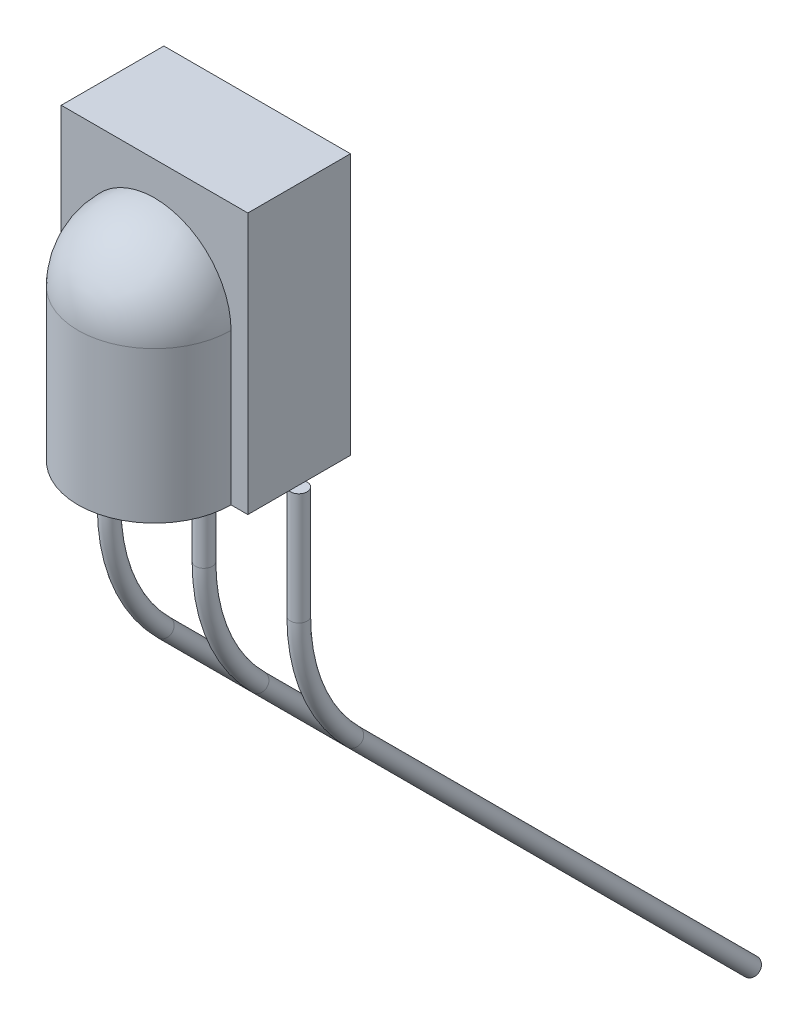
ISO-10303-21;
HEADER;
FILE_DESCRIPTION(('STEP AP214'),'2;1');
FILE_NAME('part.step','',(''),(''),'','','');
FILE_SCHEMA(('AUTOMOTIVE_DESIGN { 1 0 10303 214 1 1 1 1 }'));
ENDSEC;
DATA;
#1=APPLICATION_CONTEXT('core data for automotive mechanical design processes');
#2=APPLICATION_PROTOCOL_DEFINITION('international standard','automotive_design',2000,#1);
#3=PRODUCT_CONTEXT('',#1,'mechanical');
#4=PRODUCT('Part','Part','',(#3));
#5=PRODUCT_RELATED_PRODUCT_CATEGORY('part','',(#4));
#6=PRODUCT_DEFINITION_FORMATION('','',#4);
#7=PRODUCT_DEFINITION_CONTEXT('part definition',#1,'design');
#8=PRODUCT_DEFINITION('design','',#6,#7);
#9=PRODUCT_DEFINITION_SHAPE('','',#8);
#10=(LENGTH_UNIT() NAMED_UNIT(*) SI_UNIT(.MILLI.,.METRE.));
#11=(NAMED_UNIT(*) PLANE_ANGLE_UNIT() SI_UNIT($,.RADIAN.));
#12=(NAMED_UNIT(*) SI_UNIT($,.STERADIAN.) SOLID_ANGLE_UNIT());
#13=UNCERTAINTY_MEASURE_WITH_UNIT(LENGTH_MEASURE(1.E-05),#10,'distance_accuracy_value','');
#14=(GEOMETRIC_REPRESENTATION_CONTEXT(3) GLOBAL_UNCERTAINTY_ASSIGNED_CONTEXT((#13)) GLOBAL_UNIT_ASSIGNED_CONTEXT((#10,
#11,#12)) REPRESENTATION_CONTEXT('',''));
#15=CARTESIAN_POINT('',(0.,0.,0.));
#16=DIRECTION('',(0.,0.,1.));
#17=DIRECTION('',(1.,0.,0.));
#18=AXIS2_PLACEMENT_3D('',#15,#16,#17);
#19=CARTESIAN_POINT('',(0.,7.,-2.05));
#20=DIRECTION('',(0.,-1.,0.));
#21=DIRECTION('',(0.,0.,-1.));
#22=AXIS2_PLACEMENT_3D('',#19,#20,#21);
#23=CYLINDRICAL_SURFACE('',#22,2.05);
#24=CARTESIAN_POINT('',(0.,4.05,-2.05));
#25=DIRECTION('',(0.,1.,0.));
#26=DIRECTION('',(0.,0.,1.));
#27=AXIS2_PLACEMENT_3D('',#24,#25,#26);
#28=CIRCLE('',#27,2.05);
#29=CARTESIAN_POINT('',(-2.05,4.04999999999999,-2.05));
#30=VERTEX_POINT('',#29);
#31=CARTESIAN_POINT('',(2.05,4.04999999999999,-2.05));
#32=VERTEX_POINT('',#31);
#33=EDGE_CURVE('E150',#30,#32,#28,.T.);
#34=ORIENTED_EDGE('',*,*,#33,.F.);
#35=DIRECTION('',(0.,-1.,0.));
#36=VECTOR('',#35,1.);
#37=CARTESIAN_POINT('',(-2.05,7.,-2.05));
#38=LINE('',#37,#36);
#39=CARTESIAN_POINT('',(-2.05,0.,-2.05));
#40=VERTEX_POINT('',#39);
#41=EDGE_CURVE('E192',#30,#40,#38,.T.);
#42=ORIENTED_EDGE('',*,*,#41,.T.);
#43=CARTESIAN_POINT('',(0.,0.,-2.05));
#44=DIRECTION('',(0.,1.,0.));
#45=DIRECTION('',(0.,0.,1.));
#46=AXIS2_PLACEMENT_3D('',#43,#44,#45);
#47=CIRCLE('',#46,2.05);
#48=CARTESIAN_POINT('',(2.05,0.,-2.05));
#49=VERTEX_POINT('',#48);
#50=EDGE_CURVE('E173',#40,#49,#47,.T.);
#51=ORIENTED_EDGE('',*,*,#50,.T.);
#52=DIRECTION('',(0.,-1.,0.));
#53=VECTOR('',#52,1.);
#54=CARTESIAN_POINT('',(2.05,7.,-2.05));
#55=LINE('',#54,#53);
#56=EDGE_CURVE('E190',#32,#49,#55,.T.);
#57=ORIENTED_EDGE('',*,*,#56,.F.);
#58=EDGE_LOOP('',(#34,#42,#51,#57));
#59=FACE_BOUND('',#58,.T.);
#60=ADVANCED_FACE('F33',(#59),#23,.T.);
#61=CARTESIAN_POINT('',(0.,7.,-2.05));
#62=DIRECTION('',(0.,1.,0.));
#63=DIRECTION('',(0.,0.,1.));
#64=AXIS2_PLACEMENT_3D('',#61,#62,#63);
#65=PLANE('',#64);
#66=DIRECTION('',(1.,0.,0.));
#67=VECTOR('',#66,1.);
#68=CARTESIAN_POINT('',(-2.5,7.,-2.05));
#69=LINE('',#68,#67);
#70=CARTESIAN_POINT('',(-2.5,7.,-2.05));
#71=VERTEX_POINT('',#70);
#72=CARTESIAN_POINT('',(2.5,7.,-2.05));
#73=VERTEX_POINT('',#72);
#74=EDGE_CURVE('E159',#71,#73,#69,.T.);
#75=ORIENTED_EDGE('',*,*,#74,.T.);
#76=DIRECTION('',(0.,0.,-1.));
#77=VECTOR('',#76,1.);
#78=CARTESIAN_POINT('',(2.5,7.,-2.05));
#79=LINE('',#78,#77);
#80=CARTESIAN_POINT('',(2.5,7.,-4.8));
#81=VERTEX_POINT('',#80);
#82=EDGE_CURVE('E162',#73,#81,#79,.T.);
#83=ORIENTED_EDGE('',*,*,#82,.T.);
#84=DIRECTION('',(-1.,0.,0.));
#85=VECTOR('',#84,1.);
#86=CARTESIAN_POINT('',(-2.5,7.,-4.8));
#87=LINE('',#86,#85);
#88=CARTESIAN_POINT('',(-2.5,7.,-4.8));
#89=VERTEX_POINT('',#88);
#90=EDGE_CURVE('E164',#81,#89,#87,.T.);
#91=ORIENTED_EDGE('',*,*,#90,.T.);
#92=DIRECTION('',(0.,0.,1.));
#93=VECTOR('',#92,1.);
#94=CARTESIAN_POINT('',(-2.5,7.,-2.05));
#95=LINE('',#94,#93);
#96=EDGE_CURVE('E156',#89,#71,#95,.T.);
#97=ORIENTED_EDGE('',*,*,#96,.T.);
#98=EDGE_LOOP('',(#75,#83,#91,#97));
#99=FACE_BOUND('',#98,.T.);
#100=ADVANCED_FACE('F242',(#99),#65,.T.);
#101=CARTESIAN_POINT('',(-2.5,7.,-2.05));
#102=DIRECTION('',(1.,0.,0.));
#103=DIRECTION('',(0.,0.,-1.));
#104=AXIS2_PLACEMENT_3D('',#101,#102,#103);
#105=PLANE('',#104);
#106=DIRECTION('',(0.,0.,1.));
#107=VECTOR('',#106,1.);
#108=CARTESIAN_POINT('',(-2.5,0.,-2.05));
#109=LINE('',#108,#107);
#110=CARTESIAN_POINT('',(-2.5,0.,-4.8));
#111=VERTEX_POINT('',#110);
#112=CARTESIAN_POINT('',(-2.5,0.,-3.59641589825484));
#113=VERTEX_POINT('',#112);
#114=EDGE_CURVE('E167',#111,#113,#109,.T.);
#115=ORIENTED_EDGE('',*,*,#114,.T.);
#116=CARTESIAN_POINT('',(-2.5,0.,-3.15358410174515));
#117=VERTEX_POINT('',#116);
#118=EDGE_CURVE('E170',#113,#117,#109,.T.);
#119=ORIENTED_EDGE('',*,*,#118,.T.);
#120=CARTESIAN_POINT('',(-2.5,0.,-2.05));
#121=VERTEX_POINT('',#120);
#122=EDGE_CURVE('E155',#117,#121,#109,.T.);
#123=ORIENTED_EDGE('',*,*,#122,.T.);
#124=DIRECTION('',(0.,-1.,0.));
#125=VECTOR('',#124,1.);
#126=CARTESIAN_POINT('',(-2.5,7.,-2.05));
#127=LINE('',#126,#125);
#128=EDGE_CURVE('E194',#71,#121,#127,.T.);
#129=ORIENTED_EDGE('',*,*,#128,.F.);
#130=ORIENTED_EDGE('',*,*,#96,.F.);
#131=DIRECTION('',(0.,-1.,0.));
#132=VECTOR('',#131,1.);
#133=CARTESIAN_POINT('',(-2.5,7.,-4.8));
#134=LINE('',#133,#132);
#135=EDGE_CURVE('E166',#89,#111,#134,.T.);
#136=ORIENTED_EDGE('',*,*,#135,.T.);
#137=EDGE_LOOP('',(#115,#119,#123,#129,#130,#136));
#138=FACE_BOUND('',#137,.T.);
#139=ADVANCED_FACE('F35',(#138),#105,.F.);
#140=CARTESIAN_POINT('',(2.05,7.,-2.05));
#141=DIRECTION('',(0.,0.,-1.));
#142=DIRECTION('',(-1.,0.,0.));
#143=AXIS2_PLACEMENT_3D('',#140,#141,#142);
#144=PLANE('',#143);
#145=DIRECTION('',(0.,-1.,0.));
#146=VECTOR('',#145,1.);
#147=CARTESIAN_POINT('',(2.5,7.,-2.05));
#148=LINE('',#147,#146);
#149=CARTESIAN_POINT('',(2.5,0.,-2.05));
#150=VERTEX_POINT('',#149);
#151=EDGE_CURVE('E188',#73,#150,#148,.T.);
#152=ORIENTED_EDGE('',*,*,#151,.F.);
#153=ORIENTED_EDGE('',*,*,#74,.F.);
#154=ORIENTED_EDGE('',*,*,#128,.T.);
#155=DIRECTION('',(1.,0.,0.));
#156=VECTOR('',#155,1.);
#157=CARTESIAN_POINT('',(-2.5,0.,-2.05));
#158=LINE('',#157,#156);
#159=EDGE_CURVE('E169',#121,#40,#158,.T.);
#160=ORIENTED_EDGE('',*,*,#159,.T.);
#161=ORIENTED_EDGE('',*,*,#41,.F.);
#162=CARTESIAN_POINT('',(0.,4.05,-2.05));
#163=DIRECTION('',(0.,0.,1.));
#164=DIRECTION('',(1.,0.,0.));
#165=AXIS2_PLACEMENT_3D('',#162,#163,#164);
#166=CIRCLE('',#165,2.05);
#167=EDGE_CURVE('E153',#32,#30,#166,.T.);
#168=ORIENTED_EDGE('',*,*,#167,.F.);
#169=ORIENTED_EDGE('',*,*,#56,.T.);
#170=DIRECTION('',(1.,0.,0.));
#171=VECTOR('',#170,1.);
#172=CARTESIAN_POINT('',(2.05,0.,-2.05));
#173=LINE('',#172,#171);
#174=EDGE_CURVE('E176',#49,#150,#173,.T.);
#175=ORIENTED_EDGE('',*,*,#174,.T.);
#176=EDGE_LOOP('',(#152,#153,#154,#160,#161,#168,#169,#175));
#177=FACE_BOUND('',#176,.T.);
#178=ADVANCED_FACE('F213',(#177),#144,.F.);
#179=CARTESIAN_POINT('',(2.5,7.,-2.05));
#180=DIRECTION('',(-1.,0.,0.));
#181=DIRECTION('',(0.,0.,1.));
#182=AXIS2_PLACEMENT_3D('',#179,#180,#181);
#183=PLANE('',#182);
#184=DIRECTION('',(0.,0.,-1.));
#185=VECTOR('',#184,1.);
#186=CARTESIAN_POINT('',(2.5,0.,-2.05));
#187=LINE('',#186,#185);
#188=CARTESIAN_POINT('',(2.5,0.,-3.15358410174515));
#189=VERTEX_POINT('',#188);
#190=EDGE_CURVE('E180',#150,#189,#187,.T.);
#191=ORIENTED_EDGE('',*,*,#190,.T.);
#192=CARTESIAN_POINT('',(2.5,0.,-3.59641589825484));
#193=VERTEX_POINT('',#192);
#194=EDGE_CURVE('E124',#189,#193,#187,.T.);
#195=ORIENTED_EDGE('',*,*,#194,.T.);
#196=CARTESIAN_POINT('',(2.5,0.,-4.8));
#197=VERTEX_POINT('',#196);
#198=EDGE_CURVE('E179',#193,#197,#187,.T.);
#199=ORIENTED_EDGE('',*,*,#198,.T.);
#200=DIRECTION('',(0.,-1.,0.));
#201=VECTOR('',#200,1.);
#202=CARTESIAN_POINT('',(2.5,7.,-4.8));
#203=LINE('',#202,#201);
#204=EDGE_CURVE('E185',#81,#197,#203,.T.);
#205=ORIENTED_EDGE('',*,*,#204,.F.);
#206=ORIENTED_EDGE('',*,*,#82,.F.);
#207=ORIENTED_EDGE('',*,*,#151,.T.);
#208=EDGE_LOOP('',(#191,#195,#199,#205,#206,#207));
#209=FACE_BOUND('',#208,.T.);
#210=ADVANCED_FACE('F250',(#209),#183,.F.);
#211=CARTESIAN_POINT('',(-2.5,7.,-4.8));
#212=DIRECTION('',(0.,0.,1.));
#213=DIRECTION('',(1.,0.,0.));
#214=AXIS2_PLACEMENT_3D('',#211,#212,#213);
#215=PLANE('',#214);
#216=DIRECTION('',(-1.,0.,0.));
#217=VECTOR('',#216,1.);
#218=CARTESIAN_POINT('',(-2.5,0.,-4.8));
#219=LINE('',#218,#217);
#220=EDGE_CURVE('E160',#197,#111,#219,.T.);
#221=ORIENTED_EDGE('',*,*,#220,.T.);
#222=ORIENTED_EDGE('',*,*,#135,.F.);
#223=ORIENTED_EDGE('',*,*,#90,.F.);
#224=ORIENTED_EDGE('',*,*,#204,.T.);
#225=EDGE_LOOP('',(#221,#222,#223,#224));
#226=FACE_BOUND('',#225,.T.);
#227=ADVANCED_FACE('F234',(#226),#215,.F.);
#228=CARTESIAN_POINT('',(0.,0.,-2.05));
#229=DIRECTION('',(0.,1.,0.));
#230=DIRECTION('',(0.,0.,1.));
#231=AXIS2_PLACEMENT_3D('',#228,#229,#230);
#232=PLANE('',#231);
#233=CARTESIAN_POINT('',(2.54,0.,-3.375));
#234=DIRECTION('',(0.,1.,0.));
#235=DIRECTION('',(0.,0.,1.));
#236=AXIS2_PLACEMENT_3D('',#233,#234,#235);
#237=CIRCLE('',#236,0.225);
#238=EDGE_CURVE('E11',#189,#193,#237,.F.);
#239=ORIENTED_EDGE('',*,*,#238,.F.);
#240=ORIENTED_EDGE('',*,*,#190,.F.);
#241=ORIENTED_EDGE('',*,*,#174,.F.);
#242=ORIENTED_EDGE('',*,*,#50,.F.);
#243=ORIENTED_EDGE('',*,*,#159,.F.);
#244=ORIENTED_EDGE('',*,*,#122,.F.);
#245=CARTESIAN_POINT('',(-2.54,0.,-3.375));
#246=DIRECTION('',(0.,-1.,0.));
#247=DIRECTION('',(0.,0.,-1.));
#248=AXIS2_PLACEMENT_3D('',#245,#246,#247);
#249=CIRCLE('',#248,0.225);
#250=EDGE_CURVE('E53',#113,#117,#249,.T.);
#251=ORIENTED_EDGE('',*,*,#250,.F.);
#252=ORIENTED_EDGE('',*,*,#114,.F.);
#253=ORIENTED_EDGE('',*,*,#220,.F.);
#254=ORIENTED_EDGE('',*,*,#198,.F.);
#255=EDGE_LOOP('',(#239,#240,#241,#242,#243,#244,#251,#252,#253,#254));
#256=FACE_BOUND('',#255,.T.);
#257=CARTESIAN_POINT('',(0.,0.,-3.375));
#258=DIRECTION('',(0.,1.,0.));
#259=DIRECTION('',(0.,0.,1.));
#260=AXIS2_PLACEMENT_3D('',#257,#258,#259);
#261=CIRCLE('',#260,0.225);
#262=CARTESIAN_POINT('',(0.,0.,-3.15));
#263=VERTEX_POINT('',#262);
#264=EDGE_CURVE('E41',#263,#263,#261,.F.);
#265=ORIENTED_EDGE('',*,*,#264,.F.);
#266=EDGE_LOOP('',(#265));
#267=FACE_BOUND('',#266,.T.);
#268=ADVANCED_FACE('F216',(#256,#267),#232,.F.);
#269=CARTESIAN_POINT('',(0.,4.05,-2.05));
#270=DIRECTION('',(0.,0.,1.));
#271=DIRECTION('',(-1.,0.,0.));
#272=AXIS2_PLACEMENT_3D('',#269,#270,#271);
#273=SPHERICAL_SURFACE('',#272,2.05);
#274=ORIENTED_EDGE('',*,*,#33,.T.);
#275=ORIENTED_EDGE('',*,*,#167,.T.);
#276=EDGE_LOOP('',(#274,#275));
#277=FACE_BOUND('',#276,.T.);
#278=ADVANCED_FACE('F223',(#277),#273,.T.);
#279=CARTESIAN_POINT('',(-2.54,-17.1937609121282,-15.4976931002626));
#280=DIRECTION('',(0.,-0.707106781186551,-0.707106781186544));
#281=DIRECTION('',(0.,0.707106781186544,-0.707106781186551));
#282=AXIS2_PLACEMENT_3D('',#279,#280,#281);
#283=PLANE('',#282);
#284=CARTESIAN_POINT('',(-2.54,-17.1937609121282,-15.4976931002626));
#285=DIRECTION('',(0.,-0.707106781186551,-0.707106781186544));
#286=DIRECTION('',(0.,0.707106781186544,-0.707106781186551));
#287=AXIS2_PLACEMENT_3D('',#284,#285,#286);
#288=CIRCLE('',#287,0.225);
#289=CARTESIAN_POINT('',(-2.54,-17.0346618863612,-15.6567921260296));
#290=VERTEX_POINT('',#289);
#291=EDGE_CURVE('E137',#290,#290,#288,.T.);
#292=ORIENTED_EDGE('',*,*,#291,.T.);
#293=EDGE_LOOP('',(#292));
#294=FACE_BOUND('',#293,.T.);
#295=ADVANCED_FACE('F225',(#294),#283,.T.);
#296=CARTESIAN_POINT('',(-2.54,0.,-3.375));
#297=DIRECTION('',(0.,-1.,0.));
#298=DIRECTION('',(0.,0.,-1.));
#299=AXIS2_PLACEMENT_3D('',#296,#297,#298);
#300=PLANE('',#299);
#301=ORIENTED_EDGE('',*,*,#118,.F.);
#302=CARTESIAN_POINT('',(-2.54,0.,-3.6));
#303=VERTEX_POINT('',#302);
#304=EDGE_CURVE('E147',#303,#113,#249,.T.);
#305=ORIENTED_EDGE('',*,*,#304,.F.);
#306=EDGE_CURVE('E146',#117,#303,#249,.T.);
#307=ORIENTED_EDGE('',*,*,#306,.F.);
#308=EDGE_LOOP('',(#301,#305,#307));
#309=FACE_BOUND('',#308,.T.);
#310=ADVANCED_FACE('F206',(#309),#300,.F.);
#311=CARTESIAN_POINT('',(-2.54,-17.1937609121282,-15.4976931002626));
#312=DIRECTION('',(0.,0.707106781186551,0.707106781186544));
#313=DIRECTION('',(0.,-0.707106781186544,0.707106781186551));
#314=AXIS2_PLACEMENT_3D('',#311,#312,#313);
#315=CYLINDRICAL_SURFACE('',#314,0.225);
#316=CARTESIAN_POINT('',(-2.54,-6.53553390593272,-4.83946609406724));
#317=DIRECTION('',(0.,-0.707106781186551,-0.707106781186544));
#318=DIRECTION('',(0.,0.707106781186544,-0.707106781186551));
#319=AXIS2_PLACEMENT_3D('',#316,#317,#318);
#320=CIRCLE('',#319,0.225);
#321=CARTESIAN_POINT('',(-2.54,-6.69463293169969,-4.68036706830027));
#322=VERTEX_POINT('',#321);
#323=EDGE_CURVE('E140',#322,#322,#320,.T.);
#324=ORIENTED_EDGE('',*,*,#323,.T.);
#325=EDGE_LOOP('',(#324));
#326=FACE_BOUND('',#325,.T.);
#327=ORIENTED_EDGE('',*,*,#291,.F.);
#328=EDGE_LOOP('',(#327));
#329=FACE_BOUND('',#328,.T.);
#330=ADVANCED_FACE('F289',(#326,#329),#315,.T.);
#331=CARTESIAN_POINT('',(-2.54,-3.,-8.375));
#332=DIRECTION('',(-1.,0.,0.));
#333=DIRECTION('',(0.,0.,1.));
#334=AXIS2_PLACEMENT_3D('',#331,#332,#333);
#335=TOROIDAL_SURFACE('',#334,5.,0.225);
#336=CARTESIAN_POINT('',(-2.54,-3.,-3.375));
#337=DIRECTION('',(0.,-1.,0.));
#338=DIRECTION('',(0.,0.,-1.));
#339=AXIS2_PLACEMENT_3D('',#336,#337,#338);
#340=CIRCLE('',#339,0.225);
#341=CARTESIAN_POINT('',(-2.54,-3.,-3.15));
#342=VERTEX_POINT('',#341);
#343=EDGE_CURVE('E143',#342,#342,#340,.T.);
#344=CARTESIAN_POINT('',(-2.54,-3.,-8.375));
#345=DIRECTION('',(-1.,0.,0.));
#346=DIRECTION('',(0.,0.,1.));
#347=AXIS2_PLACEMENT_3D('',#344,#345,#346);
#348=CIRCLE('',#347,5.225);
#349=EDGE_CURVE('',#322,#342,#348,.T.);
#350=ORIENTED_EDGE('',*,*,#323,.F.);
#351=ORIENTED_EDGE('',*,*,#343,.T.);
#352=ORIENTED_EDGE('',*,*,#349,.T.);
#353=ORIENTED_EDGE('',*,*,#349,.F.);
#354=EDGE_LOOP('',(#350,#352,#351,#353));
#355=FACE_BOUND('',#354,.T.);
#356=ADVANCED_FACE('F239',(#355),#335,.T.);
#357=CARTESIAN_POINT('',(-2.54,-3.,-3.375));
#358=DIRECTION('',(0.,1.,0.));
#359=DIRECTION('',(0.,0.,1.));
#360=AXIS2_PLACEMENT_3D('',#357,#358,#359);
#361=CYLINDRICAL_SURFACE('',#360,0.225);
#362=ORIENTED_EDGE('',*,*,#304,.T.);
#363=ORIENTED_EDGE('',*,*,#250,.T.);
#364=ORIENTED_EDGE('',*,*,#306,.T.);
#365=EDGE_LOOP('',(#362,#363,#364));
#366=FACE_BOUND('',#365,.T.);
#367=ORIENTED_EDGE('',*,*,#343,.F.);
#368=EDGE_LOOP('',(#367));
#369=FACE_BOUND('',#368,.T.);
#370=ADVANCED_FACE('F202',(#366,#369),#361,.T.);
#371=CARTESIAN_POINT('',(0.,-17.1937609121282,-15.4976931002626));
#372=DIRECTION('',(0.,-0.707106781186551,-0.707106781186544));
#373=DIRECTION('',(0.,0.707106781186544,-0.707106781186551));
#374=AXIS2_PLACEMENT_3D('',#371,#372,#373);
#375=PLANE('',#374);
#376=CARTESIAN_POINT('',(0.,-17.1937609121282,-15.4976931002626));
#377=DIRECTION('',(0.,-0.707106781186551,-0.707106781186544));
#378=DIRECTION('',(0.,0.707106781186544,-0.707106781186551));
#379=AXIS2_PLACEMENT_3D('',#376,#377,#378);
#380=CIRCLE('',#379,0.225);
#381=CARTESIAN_POINT('',(0.,-17.0346618863612,-15.6567921260296));
#382=VERTEX_POINT('',#381);
#383=EDGE_CURVE('E125',#382,#382,#380,.T.);
#384=ORIENTED_EDGE('',*,*,#383,.T.);
#385=EDGE_LOOP('',(#384));
#386=FACE_BOUND('',#385,.T.);
#387=ADVANCED_FACE('F238',(#386),#375,.T.);
#388=CARTESIAN_POINT('',(0.,-17.1937609121282,-15.4976931002626));
#389=DIRECTION('',(0.,0.707106781186551,0.707106781186544));
#390=DIRECTION('',(0.,-0.707106781186544,0.707106781186551));
#391=AXIS2_PLACEMENT_3D('',#388,#389,#390);
#392=CYLINDRICAL_SURFACE('',#391,0.225);
#393=CARTESIAN_POINT('',(0.,-6.53553390593272,-4.83946609406724));
#394=DIRECTION('',(0.,-0.707106781186551,-0.707106781186544));
#395=DIRECTION('',(0.,0.707106781186544,-0.707106781186551));
#396=AXIS2_PLACEMENT_3D('',#393,#394,#395);
#397=CIRCLE('',#396,0.225);
#398=CARTESIAN_POINT('',(0.,-6.69463293169969,-4.68036706830027));
#399=VERTEX_POINT('',#398);
#400=EDGE_CURVE('E127',#399,#399,#397,.T.);
#401=ORIENTED_EDGE('',*,*,#400,.T.);
#402=EDGE_LOOP('',(#401));
#403=FACE_BOUND('',#402,.T.);
#404=ORIENTED_EDGE('',*,*,#383,.F.);
#405=EDGE_LOOP('',(#404));
#406=FACE_BOUND('',#405,.T.);
#407=ADVANCED_FACE('F322',(#403,#406),#392,.T.);
#408=CARTESIAN_POINT('',(0.,-3.,-8.375));
#409=DIRECTION('',(-1.,0.,0.));
#410=DIRECTION('',(0.,0.,1.));
#411=AXIS2_PLACEMENT_3D('',#408,#409,#410);
#412=TOROIDAL_SURFACE('',#411,5.,0.225);
#413=CARTESIAN_POINT('',(0.,-3.,-3.375));
#414=DIRECTION('',(0.,-1.,0.));
#415=DIRECTION('',(0.,0.,-1.));
#416=AXIS2_PLACEMENT_3D('',#413,#414,#415);
#417=CIRCLE('',#416,0.225);
#418=CARTESIAN_POINT('',(0.,-3.,-3.15));
#419=VERTEX_POINT('',#418);
#420=EDGE_CURVE('E134',#419,#419,#417,.T.);
#421=CARTESIAN_POINT('',(0.,-3.,-8.375));
#422=DIRECTION('',(-1.,0.,0.));
#423=DIRECTION('',(0.,0.,1.));
#424=AXIS2_PLACEMENT_3D('',#421,#422,#423);
#425=CIRCLE('',#424,5.225);
#426=EDGE_CURVE('',#399,#419,#425,.T.);
#427=ORIENTED_EDGE('',*,*,#400,.F.);
#428=ORIENTED_EDGE('',*,*,#420,.T.);
#429=ORIENTED_EDGE('',*,*,#426,.T.);
#430=ORIENTED_EDGE('',*,*,#426,.F.);
#431=EDGE_LOOP('',(#427,#429,#428,#430));
#432=FACE_BOUND('',#431,.T.);
#433=ADVANCED_FACE('F332',(#432),#412,.T.);
#434=CARTESIAN_POINT('',(0.,-3.,-3.375));
#435=DIRECTION('',(0.,1.,0.));
#436=DIRECTION('',(0.,0.,1.));
#437=AXIS2_PLACEMENT_3D('',#434,#435,#436);
#438=CYLINDRICAL_SURFACE('',#437,0.225);
#439=ORIENTED_EDGE('',*,*,#264,.T.);
#440=EDGE_LOOP('',(#439));
#441=FACE_BOUND('',#440,.T.);
#442=ORIENTED_EDGE('',*,*,#420,.F.);
#443=EDGE_LOOP('',(#442));
#444=FACE_BOUND('',#443,.T.);
#445=ADVANCED_FACE('F233',(#441,#444),#438,.T.);
#446=CARTESIAN_POINT('',(2.54,0.,-3.375));
#447=DIRECTION('',(0.,-1.,0.));
#448=DIRECTION('',(0.,0.,-1.));
#449=AXIS2_PLACEMENT_3D('',#446,#447,#448);
#450=PLANE('',#449);
#451=CARTESIAN_POINT('',(2.54,0.,-3.375));
#452=DIRECTION('',(0.,-1.,0.));
#453=DIRECTION('',(0.,0.,-1.));
#454=AXIS2_PLACEMENT_3D('',#451,#452,#453);
#455=CIRCLE('',#454,0.225);
#456=CARTESIAN_POINT('',(2.54,0.,-3.6));
#457=VERTEX_POINT('',#456);
#458=EDGE_CURVE('E114',#193,#457,#455,.T.);
#459=ORIENTED_EDGE('',*,*,#458,.F.);
#460=ORIENTED_EDGE('',*,*,#194,.F.);
#461=EDGE_CURVE('E118',#457,#189,#455,.T.);
#462=ORIENTED_EDGE('',*,*,#461,.F.);
#463=EDGE_LOOP('',(#459,#460,#462));
#464=FACE_BOUND('',#463,.T.);
#465=ADVANCED_FACE('F123',(#464),#450,.F.);
#466=CARTESIAN_POINT('',(2.54,-17.1937609121282,-15.4976931002626));
#467=DIRECTION('',(0.,-0.707106781186551,-0.707106781186544));
#468=DIRECTION('',(0.,0.707106781186544,-0.707106781186551));
#469=AXIS2_PLACEMENT_3D('',#466,#467,#468);
#470=PLANE('',#469);
#471=CARTESIAN_POINT('',(2.54,-17.1937609121282,-15.4976931002626));
#472=DIRECTION('',(0.,-0.707106781186551,-0.707106781186544));
#473=DIRECTION('',(0.,0.707106781186544,-0.707106781186551));
#474=AXIS2_PLACEMENT_3D('',#471,#472,#473);
#475=CIRCLE('',#474,0.225);
#476=CARTESIAN_POINT('',(2.54,-17.0346618863612,-15.6567921260296));
#477=VERTEX_POINT('',#476);
#478=EDGE_CURVE('E406',#477,#477,#475,.T.);
#479=ORIENTED_EDGE('',*,*,#478,.T.);
#480=EDGE_LOOP('',(#479));
#481=FACE_BOUND('',#480,.T.);
#482=ADVANCED_FACE('F359',(#481),#470,.T.);
#483=CARTESIAN_POINT('',(2.54,-17.1937609121282,-15.4976931002626));
#484=DIRECTION('',(0.,0.707106781186551,0.707106781186544));
#485=DIRECTION('',(0.,-0.707106781186544,0.707106781186551));
#486=AXIS2_PLACEMENT_3D('',#483,#484,#485);
#487=CYLINDRICAL_SURFACE('',#486,0.225);
#488=CARTESIAN_POINT('',(2.54,-6.53553390593272,-4.83946609406724));
#489=DIRECTION('',(0.,-0.707106781186551,-0.707106781186544));
#490=DIRECTION('',(0.,0.707106781186544,-0.707106781186551));
#491=AXIS2_PLACEMENT_3D('',#488,#489,#490);
#492=CIRCLE('',#491,0.225);
#493=CARTESIAN_POINT('',(2.54,-6.69463293169969,-4.68036706830027));
#494=VERTEX_POINT('',#493);
#495=EDGE_CURVE('E405',#494,#494,#492,.T.);
#496=ORIENTED_EDGE('',*,*,#495,.T.);
#497=EDGE_LOOP('',(#496));
#498=FACE_BOUND('',#497,.T.);
#499=ORIENTED_EDGE('',*,*,#478,.F.);
#500=EDGE_LOOP('',(#499));
#501=FACE_BOUND('',#500,.T.);
#502=ADVANCED_FACE('F368',(#498,#501),#487,.T.);
#503=CARTESIAN_POINT('',(2.54,-3.,-8.375));
#504=DIRECTION('',(-1.,0.,0.));
#505=DIRECTION('',(0.,0.,1.));
#506=AXIS2_PLACEMENT_3D('',#503,#504,#505);
#507=TOROIDAL_SURFACE('',#506,5.,0.225);
#508=CARTESIAN_POINT('',(2.54,-3.,-3.375));
#509=DIRECTION('',(0.,-1.,0.));
#510=DIRECTION('',(0.,0.,-1.));
#511=AXIS2_PLACEMENT_3D('',#508,#509,#510);
#512=CIRCLE('',#511,0.225);
#513=CARTESIAN_POINT('',(2.54,-3.,-3.15));
#514=VERTEX_POINT('',#513);
#515=EDGE_CURVE('E121',#514,#514,#512,.T.);
#516=CARTESIAN_POINT('',(2.54,-3.,-8.375));
#517=DIRECTION('',(-1.,0.,0.));
#518=DIRECTION('',(0.,0.,1.));
#519=AXIS2_PLACEMENT_3D('',#516,#517,#518);
#520=CIRCLE('',#519,5.225);
#521=EDGE_CURVE('',#494,#514,#520,.T.);
#522=ORIENTED_EDGE('',*,*,#495,.F.);
#523=ORIENTED_EDGE('',*,*,#515,.T.);
#524=ORIENTED_EDGE('',*,*,#521,.T.);
#525=ORIENTED_EDGE('',*,*,#521,.F.);
#526=EDGE_LOOP('',(#522,#524,#523,#525));
#527=FACE_BOUND('',#526,.T.);
#528=ADVANCED_FACE('F378',(#527),#507,.T.);
#529=CARTESIAN_POINT('',(2.54,-3.,-3.375));
#530=DIRECTION('',(0.,1.,0.));
#531=DIRECTION('',(0.,0.,1.));
#532=AXIS2_PLACEMENT_3D('',#529,#530,#531);
#533=CYLINDRICAL_SURFACE('',#532,0.225);
#534=ORIENTED_EDGE('',*,*,#461,.T.);
#535=ORIENTED_EDGE('',*,*,#238,.T.);
#536=ORIENTED_EDGE('',*,*,#458,.T.);
#537=EDGE_LOOP('',(#534,#535,#536));
#538=FACE_BOUND('',#537,.T.);
#539=ORIENTED_EDGE('',*,*,#515,.F.);
#540=EDGE_LOOP('',(#539));
#541=FACE_BOUND('',#540,.T.);
#542=ADVANCED_FACE('F116',(#538,#541),#533,.T.);
#543=CLOSED_SHELL('',(#60,#100,#139,#178,#210,#227,#268,#278,#295,#310,#330,#356,#370,#387,#407,
#433,#445,#465,#482,#502,#528,#542));
#544=MANIFOLD_SOLID_BREP('B2',#543);
#545=ADVANCED_BREP_SHAPE_REPRESENTATION('',(#18,#544),#14);
#546=SHAPE_DEFINITION_REPRESENTATION(#9,#545);
ENDSEC;
END-ISO-10303-21;
